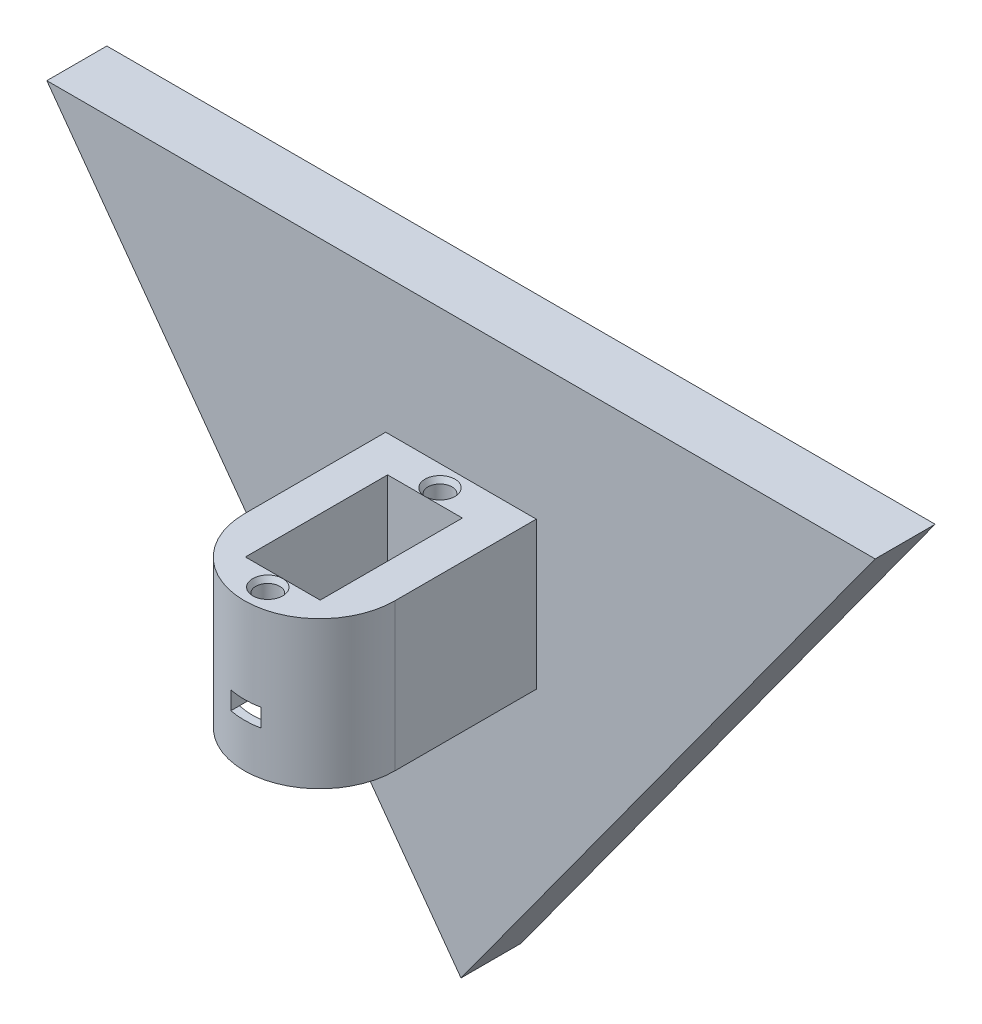
ISO-10303-21;
HEADER;
FILE_DESCRIPTION(('STEP AP214'),'2;1');
FILE_NAME('part.step','',(''),(''),'','','');
FILE_SCHEMA(('AUTOMOTIVE_DESIGN { 1 0 10303 214 1 1 1 1 }'));
ENDSEC;
DATA;
#1=APPLICATION_CONTEXT('core data for automotive mechanical design processes');
#2=APPLICATION_PROTOCOL_DEFINITION('international standard','automotive_design',2000,#1);
#3=PRODUCT_CONTEXT('',#1,'mechanical');
#4=PRODUCT('Part','Part','',(#3));
#5=PRODUCT_RELATED_PRODUCT_CATEGORY('part','',(#4));
#6=PRODUCT_DEFINITION_FORMATION('','',#4);
#7=PRODUCT_DEFINITION_CONTEXT('part definition',#1,'design');
#8=PRODUCT_DEFINITION('design','',#6,#7);
#9=PRODUCT_DEFINITION_SHAPE('','',#8);
#10=(LENGTH_UNIT() NAMED_UNIT(*) SI_UNIT(.MILLI.,.METRE.));
#11=(NAMED_UNIT(*) PLANE_ANGLE_UNIT() SI_UNIT($,.RADIAN.));
#12=(NAMED_UNIT(*) SI_UNIT($,.STERADIAN.) SOLID_ANGLE_UNIT());
#13=UNCERTAINTY_MEASURE_WITH_UNIT(LENGTH_MEASURE(1.E-05),#10,'distance_accuracy_value','');
#14=(GEOMETRIC_REPRESENTATION_CONTEXT(3) GLOBAL_UNCERTAINTY_ASSIGNED_CONTEXT((#13)) GLOBAL_UNIT_ASSIGNED_CONTEXT((#10,
#11,#12)) REPRESENTATION_CONTEXT('',''));
#15=CARTESIAN_POINT('',(0.,0.,0.));
#16=DIRECTION('',(0.,0.,1.));
#17=DIRECTION('',(1.,0.,0.));
#18=AXIS2_PLACEMENT_3D('',#15,#16,#17);
#19=CARTESIAN_POINT('',(-6.23,55.2500254806121,16.));
#20=DIRECTION('',(0.,1.,0.));
#21=DIRECTION('',(0.,0.,1.));
#22=AXIS2_PLACEMENT_3D('',#19,#20,#21);
#23=PLANE('',#22);
#24=DIRECTION('',(0.,0.,1.));
#25=VECTOR('',#24,1.);
#26=CARTESIAN_POINT('',(2.50000000000001,55.2500254806121,-0.001000000000001));
#27=LINE('',#26,#25);
#28=CARTESIAN_POINT('',(2.50000000000001,55.2500254806121,39.7));
#29=VERTEX_POINT('',#28);
#30=CARTESIAN_POINT('',(2.50000000000001,55.2500254806121,44.4161170617659));
#31=VERTEX_POINT('',#30);
#32=EDGE_CURVE('E191',#29,#31,#27,.T.);
#33=ORIENTED_EDGE('',*,*,#32,.F.);
#34=DIRECTION('',(1.,0.,0.));
#35=VECTOR('',#34,1.);
#36=CARTESIAN_POINT('',(-6.23,55.2500254806121,39.7));
#37=LINE('',#36,#35);
#38=CARTESIAN_POINT('',(6.23,55.2500254806121,39.7));
#39=VERTEX_POINT('',#38);
#40=EDGE_CURVE('E264',#29,#39,#37,.T.);
#41=ORIENTED_EDGE('',*,*,#40,.T.);
#42=DIRECTION('',(0.,0.,-1.));
#43=VECTOR('',#42,1.);
#44=CARTESIAN_POINT('',(6.23,55.2500254806121,39.7));
#45=LINE('',#44,#43);
#46=CARTESIAN_POINT('',(6.23,55.2500254806121,24.3028599015696));
#47=VERTEX_POINT('',#46);
#48=EDGE_CURVE('E257',#39,#47,#45,.T.);
#49=ORIENTED_EDGE('',*,*,#48,.T.);
#50=CARTESIAN_POINT('',(0.,55.2500254806121,33.55));
#51=DIRECTION('',(0.,1.,0.));
#52=DIRECTION('',(0.,0.,1.));
#53=AXIS2_PLACEMENT_3D('',#50,#51,#52);
#54=CIRCLE('',#53,11.15);
#55=EDGE_CURVE('E252',#31,#47,#54,.T.);
#56=ORIENTED_EDGE('',*,*,#55,.F.);
#57=EDGE_LOOP('',(#33,#41,#49,#56));
#58=FACE_BOUND('',#57,.T.);
#59=ADVANCED_FACE('F41',(#58),#23,.F.);
#60=CARTESIAN_POINT('',(-6.23,11.2879454134343,39.7));
#61=DIRECTION('',(0.,0.,-1.));
#62=DIRECTION('',(-1.,0.,0.));
#63=AXIS2_PLACEMENT_3D('',#60,#61,#62);
#64=PLANE('',#63);
#65=DIRECTION('',(-1.,0.,0.));
#66=VECTOR('',#65,1.);
#67=CARTESIAN_POINT('',(-2.49999999999999,58.2500254806121,39.7));
#68=LINE('',#67,#66);
#69=CARTESIAN_POINT('',(2.50000000000001,58.2500254806121,39.7));
#70=VERTEX_POINT('',#69);
#71=CARTESIAN_POINT('',(-2.49999999999999,58.2500254806121,39.7));
#72=VERTEX_POINT('',#71);
#73=EDGE_CURVE('E205',#70,#72,#68,.T.);
#74=ORIENTED_EDGE('',*,*,#73,.T.);
#75=DIRECTION('',(0.,-1.,0.));
#76=VECTOR('',#75,1.);
#77=CARTESIAN_POINT('',(-2.49999999999999,58.2500254806121,39.7));
#78=LINE('',#77,#76);
#79=CARTESIAN_POINT('',(-2.49999999999999,55.2500254806121,39.7));
#80=VERTEX_POINT('',#79);
#81=EDGE_CURVE('E200',#72,#80,#78,.T.);
#82=ORIENTED_EDGE('',*,*,#81,.T.);
#83=CARTESIAN_POINT('',(-6.23,55.2500254806121,39.7));
#84=VERTEX_POINT('',#83);
#85=EDGE_CURVE('E288',#84,#80,#37,.T.);
#86=ORIENTED_EDGE('',*,*,#85,.F.);
#87=DIRECTION('',(0.,1.,0.));
#88=VECTOR('',#87,1.);
#89=CARTESIAN_POINT('',(-6.23,11.2879454134343,39.7));
#90=LINE('',#89,#88);
#91=CARTESIAN_POINT('',(-6.23,72.5000254806121,39.7));
#92=VERTEX_POINT('',#91);
#93=EDGE_CURVE('E284',#84,#92,#90,.T.);
#94=ORIENTED_EDGE('',*,*,#93,.T.);
#95=DIRECTION('',(-1.,0.,0.));
#96=VECTOR('',#95,1.);
#97=CARTESIAN_POINT('',(-6.23,72.5000254806121,39.7));
#98=LINE('',#97,#96);
#99=CARTESIAN_POINT('',(0.,72.5000254806121,39.7));
#100=VERTEX_POINT('',#99);
#101=EDGE_CURVE('E263',#100,#92,#98,.T.);
#102=ORIENTED_EDGE('',*,*,#101,.F.);
#103=CARTESIAN_POINT('',(6.23,72.5000254806121,39.7));
#104=VERTEX_POINT('',#103);
#105=EDGE_CURVE('E266',#104,#100,#98,.T.);
#106=ORIENTED_EDGE('',*,*,#105,.F.);
#107=DIRECTION('',(0.,1.,0.));
#108=VECTOR('',#107,1.);
#109=CARTESIAN_POINT('',(6.23,11.2879454134343,39.7));
#110=LINE('',#109,#108);
#111=EDGE_CURVE('E276',#39,#104,#110,.T.);
#112=ORIENTED_EDGE('',*,*,#111,.F.);
#113=ORIENTED_EDGE('',*,*,#40,.F.);
#114=DIRECTION('',(0.,1.,0.));
#115=VECTOR('',#114,1.);
#116=CARTESIAN_POINT('',(2.50000000000001,58.2500254806121,39.7));
#117=LINE('',#116,#115);
#118=EDGE_CURVE('E210',#29,#70,#117,.T.);
#119=ORIENTED_EDGE('',*,*,#118,.T.);
#120=EDGE_LOOP('',(#74,#82,#86,#94,#102,#106,#112,#113,#119));
#121=FACE_BOUND('',#120,.T.);
#122=ADVANCED_FACE('F347',(#121),#64,.T.);
#123=CARTESIAN_POINT('',(-6.23,72.5000254806121,16.));
#124=DIRECTION('',(0.,-1.,0.));
#125=DIRECTION('',(0.,0.,-1.));
#126=AXIS2_PLACEMENT_3D('',#123,#124,#125);
#127=PLANE('',#126);
#128=DIRECTION('',(0.,0.,1.));
#129=VECTOR('',#128,1.);
#130=CARTESIAN_POINT('',(-12.5467811820916,72.5000254806121,33.55));
#131=LINE('',#130,#129);
#132=CARTESIAN_POINT('',(-12.5467811820916,72.5000254806121,10.));
#133=VERTEX_POINT('',#132);
#134=CARTESIAN_POINT('',(-12.5467811820916,72.5000254806121,33.55));
#135=VERTEX_POINT('',#134);
#136=EDGE_CURVE('E272',#133,#135,#131,.T.);
#137=ORIENTED_EDGE('',*,*,#136,.T.);
#138=CARTESIAN_POINT('',(0.,72.5000254806121,33.55));
#139=DIRECTION('',(0.,1.,0.));
#140=DIRECTION('',(0.,0.,1.));
#141=AXIS2_PLACEMENT_3D('',#138,#139,#140);
#142=CIRCLE('',#141,12.5467811820916);
#143=CARTESIAN_POINT('',(12.5467811820916,72.5000254806121,33.55));
#144=VERTEX_POINT('',#143);
#145=EDGE_CURVE('E274',#135,#144,#142,.T.);
#146=ORIENTED_EDGE('',*,*,#145,.T.);
#147=DIRECTION('',(0.,0.,-1.));
#148=VECTOR('',#147,1.);
#149=CARTESIAN_POINT('',(12.5467811820916,72.5000254806121,33.55));
#150=LINE('',#149,#148);
#151=CARTESIAN_POINT('',(12.5467811820916,72.5000254806121,10.));
#152=VERTEX_POINT('',#151);
#153=EDGE_CURVE('E280',#144,#152,#150,.T.);
#154=ORIENTED_EDGE('',*,*,#153,.T.);
#155=DIRECTION('',(-1.,0.,0.));
#156=VECTOR('',#155,1.);
#157=CARTESIAN_POINT('',(-6.23,72.5000254806121,10.));
#158=LINE('',#157,#156);
#159=EDGE_CURVE('E174',#152,#133,#158,.T.);
#160=ORIENTED_EDGE('',*,*,#159,.T.);
#161=EDGE_LOOP('',(#137,#146,#154,#160));
#162=FACE_BOUND('',#161,.T.);
#163=DIRECTION('',(0.,0.,-1.));
#164=VECTOR('',#163,1.);
#165=CARTESIAN_POINT('',(-6.23,72.5000254806121,10.));
#166=LINE('',#165,#164);
#167=CARTESIAN_POINT('',(-6.23,72.5000254806121,16.));
#168=VERTEX_POINT('',#167);
#169=EDGE_CURVE('E267',#92,#168,#166,.T.);
#170=ORIENTED_EDGE('',*,*,#169,.T.);
#171=DIRECTION('',(-1.,0.,0.));
#172=VECTOR('',#171,1.);
#173=CARTESIAN_POINT('',(-6.23,72.5000254806121,16.));
#174=LINE('',#173,#172);
#175=CARTESIAN_POINT('',(0.,72.5000254806121,16.));
#176=VERTEX_POINT('',#175);
#177=EDGE_CURVE('E299',#176,#168,#174,.T.);
#178=ORIENTED_EDGE('',*,*,#177,.F.);
#179=CARTESIAN_POINT('',(0.,72.5000254806121,13.5));
#180=DIRECTION('',(0.,-1.,0.));
#181=DIRECTION('',(0.,0.,-1.));
#182=AXIS2_PLACEMENT_3D('',#179,#180,#181);
#183=CIRCLE('',#182,2.50000000000001);
#184=EDGE_CURVE('E318',#176,#176,#183,.T.);
#185=ORIENTED_EDGE('',*,*,#184,.T.);
#186=CARTESIAN_POINT('',(6.23,72.5000254806121,16.));
#187=VERTEX_POINT('',#186);
#188=EDGE_CURVE('E297',#187,#176,#174,.T.);
#189=ORIENTED_EDGE('',*,*,#188,.F.);
#190=DIRECTION('',(0.,0.,1.));
#191=VECTOR('',#190,1.);
#192=CARTESIAN_POINT('',(6.23,72.5000254806121,39.7));
#193=LINE('',#192,#191);
#194=EDGE_CURVE('E253',#187,#104,#193,.T.);
#195=ORIENTED_EDGE('',*,*,#194,.T.);
#196=ORIENTED_EDGE('',*,*,#105,.T.);
#197=CARTESIAN_POINT('',(0.,72.5000254806121,42.2));
#198=DIRECTION('',(0.,-1.,0.));
#199=DIRECTION('',(0.,0.,-1.));
#200=AXIS2_PLACEMENT_3D('',#197,#198,#199);
#201=CIRCLE('',#200,2.50000000000002);
#202=EDGE_CURVE('E321',#100,#100,#201,.T.);
#203=ORIENTED_EDGE('',*,*,#202,.T.);
#204=ORIENTED_EDGE('',*,*,#101,.T.);
#205=EDGE_LOOP('',(#170,#178,#185,#189,#195,#196,#203,#204));
#206=FACE_BOUND('',#205,.T.);
#207=ADVANCED_FACE('F352',(#162,#206),#127,.F.);
#208=CARTESIAN_POINT('',(0.,11.2879454134343,33.55));
#209=DIRECTION('',(0.,1.,0.));
#210=DIRECTION('',(0.,0.,1.));
#211=AXIS2_PLACEMENT_3D('',#208,#209,#210);
#212=CYLINDRICAL_SURFACE('',#211,12.5467811820916);
#213=CARTESIAN_POINT('',(0.,47.9500254806121,33.55));
#214=DIRECTION('',(0.,-1.,0.));
#215=DIRECTION('',(0.,0.,-1.));
#216=AXIS2_PLACEMENT_3D('',#213,#214,#215);
#217=CIRCLE('',#216,12.5467811820916);
#218=CARTESIAN_POINT('',(12.5467811820916,47.9500254806121,33.55));
#219=VERTEX_POINT('',#218);
#220=CARTESIAN_POINT('',(-12.5467811820916,47.9500254806121,33.55));
#221=VERTEX_POINT('',#220);
#222=EDGE_CURVE('E248',#219,#221,#217,.T.);
#223=ORIENTED_EDGE('',*,*,#222,.F.);
#224=DIRECTION('',(0.,1.,0.));
#225=VECTOR('',#224,1.);
#226=CARTESIAN_POINT('',(12.5467811820916,11.2879454134343,33.55));
#227=LINE('',#226,#225);
#228=EDGE_CURVE('E181',#219,#144,#227,.T.);
#229=ORIENTED_EDGE('',*,*,#228,.T.);
#230=ORIENTED_EDGE('',*,*,#145,.F.);
#231=DIRECTION('',(0.,1.,0.));
#232=VECTOR('',#231,1.);
#233=CARTESIAN_POINT('',(-12.5467811820916,11.2879454134343,33.55));
#234=LINE('',#233,#232);
#235=EDGE_CURVE('E62',#221,#135,#234,.T.);
#236=ORIENTED_EDGE('',*,*,#235,.F.);
#237=EDGE_LOOP('',(#223,#229,#230,#236));
#238=FACE_BOUND('',#237,.T.);
#239=CARTESIAN_POINT('',(0.,55.2500254806121,33.55));
#240=DIRECTION('',(0.,-1.,0.));
#241=DIRECTION('',(0.,0.,-1.));
#242=AXIS2_PLACEMENT_3D('',#239,#240,#241);
#243=CIRCLE('',#242,12.5467811820916);
#244=CARTESIAN_POINT('',(2.50000000000001,55.2500254806121,45.8451908497302));
#245=VERTEX_POINT('',#244);
#246=CARTESIAN_POINT('',(-2.49999999999999,55.2500254806121,45.8451908497302));
#247=VERTEX_POINT('',#246);
#248=EDGE_CURVE('E216',#245,#247,#243,.T.);
#249=ORIENTED_EDGE('',*,*,#248,.T.);
#250=DIRECTION('',(0.,1.,0.));
#251=VECTOR('',#250,1.);
#252=CARTESIAN_POINT('',(-2.49999999999999,11.2879454134343,45.8451908497302));
#253=LINE('',#252,#251);
#254=CARTESIAN_POINT('',(-2.49999999999999,58.2500254806121,45.8451908497302));
#255=VERTEX_POINT('',#254);
#256=EDGE_CURVE('E201',#247,#255,#253,.T.);
#257=ORIENTED_EDGE('',*,*,#256,.T.);
#258=CARTESIAN_POINT('',(0.,58.2500254806121,33.55));
#259=DIRECTION('',(0.,1.,0.));
#260=DIRECTION('',(0.,0.,1.));
#261=AXIS2_PLACEMENT_3D('',#258,#259,#260);
#262=CIRCLE('',#261,12.5467811820916);
#263=CARTESIAN_POINT('',(2.50000000000001,58.2500254806121,45.8451908497302));
#264=VERTEX_POINT('',#263);
#265=EDGE_CURVE('E207',#255,#264,#262,.T.);
#266=ORIENTED_EDGE('',*,*,#265,.T.);
#267=DIRECTION('',(0.,1.,0.));
#268=VECTOR('',#267,1.);
#269=CARTESIAN_POINT('',(2.50000000000001,11.2879454134343,45.8451908497302));
#270=LINE('',#269,#268);
#271=EDGE_CURVE('E208',#264,#245,#270,.F.);
#272=ORIENTED_EDGE('',*,*,#271,.T.);
#273=EDGE_LOOP('',(#249,#257,#266,#272));
#274=FACE_BOUND('',#273,.T.);
#275=ADVANCED_FACE('F371',(#238,#274),#212,.T.);
#276=CARTESIAN_POINT('',(0.,107.987681704295,33.55));
#277=DIRECTION('',(0.,-1.,0.));
#278=DIRECTION('',(0.,0.,-1.));
#279=AXIS2_PLACEMENT_3D('',#276,#277,#278);
#280=CYLINDRICAL_SURFACE('',#279,11.15);
#281=CARTESIAN_POINT('',(0.,47.9500254806121,33.55));
#282=DIRECTION('',(0.,-1.,0.));
#283=DIRECTION('',(0.,0.,-1.));
#284=AXIS2_PLACEMENT_3D('',#281,#282,#283);
#285=CIRCLE('',#284,11.15);
#286=CARTESIAN_POINT('',(0.,47.9500254806121,22.4));
#287=VERTEX_POINT('',#286);
#288=EDGE_CURVE('E242',#287,#287,#285,.T.);
#289=ORIENTED_EDGE('',*,*,#288,.T.);
#290=EDGE_LOOP('',(#289));
#291=FACE_BOUND('',#290,.T.);
#292=CARTESIAN_POINT('',(0.,55.2500254806121,33.55));
#293=DIRECTION('',(0.,1.,0.));
#294=DIRECTION('',(0.,0.,1.));
#295=AXIS2_PLACEMENT_3D('',#292,#293,#294);
#296=CIRCLE('',#295,11.15);
#297=CARTESIAN_POINT('',(-6.23,55.2500254806121,24.3028599015696));
#298=VERTEX_POINT('',#297);
#299=EDGE_CURVE('E11',#298,#47,#296,.F.);
#300=ORIENTED_EDGE('',*,*,#299,.F.);
#301=CARTESIAN_POINT('',(-2.49999999999999,55.2500254806121,44.4161170617659));
#302=VERTEX_POINT('',#301);
#303=EDGE_CURVE('E255',#298,#302,#54,.T.);
#304=ORIENTED_EDGE('',*,*,#303,.T.);
#305=EDGE_CURVE('E258',#302,#31,#54,.T.);
#306=ORIENTED_EDGE('',*,*,#305,.T.);
#307=ORIENTED_EDGE('',*,*,#55,.T.);
#308=EDGE_LOOP('',(#300,#304,#306,#307));
#309=FACE_BOUND('',#308,.T.);
#310=ADVANCED_FACE('F365',(#291,#309),#280,.F.);
#311=ORIENTED_EDGE('',*,*,#85,.T.);
#312=DIRECTION('',(0.,0.,1.));
#313=VECTOR('',#312,1.);
#314=CARTESIAN_POINT('',(-2.49999999999999,55.2500254806121,-0.001000000000001));
#315=LINE('',#314,#313);
#316=EDGE_CURVE('E217',#80,#302,#315,.T.);
#317=ORIENTED_EDGE('',*,*,#316,.T.);
#318=ORIENTED_EDGE('',*,*,#303,.F.);
#319=DIRECTION('',(0.,0.,1.));
#320=VECTOR('',#319,1.);
#321=CARTESIAN_POINT('',(-6.23,55.2500254806121,10.));
#322=LINE('',#321,#320);
#323=EDGE_CURVE('E179',#298,#84,#322,.T.);
#324=ORIENTED_EDGE('',*,*,#323,.T.);
#325=EDGE_LOOP('',(#311,#317,#318,#324));
#326=FACE_BOUND('',#325,.T.);
#327=ADVANCED_FACE('F346',(#326),#23,.F.);
#328=CARTESIAN_POINT('',(-54.4906896004018,75.,10.));
#329=DIRECTION('',(0.809016994374949,0.587785252292471,0.));
#330=DIRECTION('',(-0.587785252292471,0.809016994374949,0.));
#331=AXIS2_PLACEMENT_3D('',#328,#329,#330);
#332=PLANE('',#331);
#333=DIRECTION('',(0.587785252292471,-0.809016994374949,0.));
#334=VECTOR('',#333,1.);
#335=CARTESIAN_POINT('',(-54.4906896004018,75.,0.));
#336=LINE('',#335,#334);
#337=CARTESIAN_POINT('',(-69.0215401605087,95.,0.));
#338=VERTEX_POINT('',#337);
#339=CARTESIAN_POINT('',(0.,0.,0.));
#340=VERTEX_POINT('',#339);
#341=EDGE_CURVE('E303',#338,#340,#336,.T.);
#342=ORIENTED_EDGE('',*,*,#341,.T.);
#343=DIRECTION('',(0.,0.,-1.));
#344=VECTOR('',#343,1.);
#345=CARTESIAN_POINT('',(0.,0.,10.));
#346=LINE('',#345,#344);
#347=CARTESIAN_POINT('',(0.,0.,10.));
#348=VERTEX_POINT('',#347);
#349=EDGE_CURVE('E311',#348,#340,#346,.T.);
#350=ORIENTED_EDGE('',*,*,#349,.F.);
#351=DIRECTION('',(0.587785252292471,-0.809016994374949,0.));
#352=VECTOR('',#351,1.);
#353=CARTESIAN_POINT('',(-54.4906896004018,75.,10.));
#354=LINE('',#353,#352);
#355=CARTESIAN_POINT('',(-69.0215401605087,95.,10.));
#356=VERTEX_POINT('',#355);
#357=EDGE_CURVE('E304',#356,#348,#354,.T.);
#358=ORIENTED_EDGE('',*,*,#357,.F.);
#359=DIRECTION('',(0.,0.,-1.));
#360=VECTOR('',#359,1.);
#361=CARTESIAN_POINT('',(-69.0215401605087,95.,10.));
#362=LINE('',#361,#360);
#363=EDGE_CURVE('E235',#356,#338,#362,.T.);
#364=ORIENTED_EDGE('',*,*,#363,.T.);
#365=EDGE_LOOP('',(#342,#350,#358,#364));
#366=FACE_BOUND('',#365,.T.);
#367=ADVANCED_FACE('F363',(#366),#332,.F.);
#368=CARTESIAN_POINT('',(0.,0.,10.));
#369=DIRECTION('',(-0.809016994374949,0.587785252292471,0.));
#370=DIRECTION('',(-0.587785252292471,-0.809016994374949,0.));
#371=AXIS2_PLACEMENT_3D('',#368,#369,#370);
#372=PLANE('',#371);
#373=DIRECTION('',(0.587785252292471,0.809016994374949,0.));
#374=VECTOR('',#373,1.);
#375=CARTESIAN_POINT('',(0.,0.,0.));
#376=LINE('',#375,#374);
#377=CARTESIAN_POINT('',(69.0215401605087,95.,0.));
#378=VERTEX_POINT('',#377);
#379=EDGE_CURVE('E307',#340,#378,#376,.T.);
#380=ORIENTED_EDGE('',*,*,#379,.T.);
#381=DIRECTION('',(0.,0.,-1.));
#382=VECTOR('',#381,1.);
#383=CARTESIAN_POINT('',(69.0215401605087,95.,10.));
#384=LINE('',#383,#382);
#385=CARTESIAN_POINT('',(69.0215401605087,95.,10.));
#386=VERTEX_POINT('',#385);
#387=EDGE_CURVE('E240',#386,#378,#384,.T.);
#388=ORIENTED_EDGE('',*,*,#387,.F.);
#389=DIRECTION('',(0.587785252292471,0.809016994374949,0.));
#390=VECTOR('',#389,1.);
#391=CARTESIAN_POINT('',(0.,0.,10.));
#392=LINE('',#391,#390);
#393=EDGE_CURVE('E308',#348,#386,#392,.T.);
#394=ORIENTED_EDGE('',*,*,#393,.F.);
#395=ORIENTED_EDGE('',*,*,#349,.T.);
#396=EDGE_LOOP('',(#380,#388,#394,#395));
#397=FACE_BOUND('',#396,.T.);
#398=ADVANCED_FACE('F368',(#397),#372,.F.);
#399=CARTESIAN_POINT('',(0.,0.,10.));
#400=DIRECTION('',(0.,0.,1.));
#401=DIRECTION('',(1.,0.,0.));
#402=AXIS2_PLACEMENT_3D('',#399,#400,#401);
#403=PLANE('',#402);
#404=DIRECTION('',(1.,0.,0.));
#405=VECTOR('',#404,1.);
#406=CARTESIAN_POINT('',(-12.5467811820916,47.9500254806121,10.));
#407=LINE('',#406,#405);
#408=CARTESIAN_POINT('',(-12.5467811820916,47.9500254806121,10.));
#409=VERTEX_POINT('',#408);
#410=CARTESIAN_POINT('',(12.5467811820916,47.9500254806121,10.));
#411=VERTEX_POINT('',#410);
#412=EDGE_CURVE('E173',#409,#411,#407,.T.);
#413=ORIENTED_EDGE('',*,*,#412,.F.);
#414=DIRECTION('',(0.,1.,0.));
#415=VECTOR('',#414,1.);
#416=CARTESIAN_POINT('',(-12.5467811820916,11.2879454134343,10.));
#417=LINE('',#416,#415);
#418=EDGE_CURVE('E60',#409,#133,#417,.T.);
#419=ORIENTED_EDGE('',*,*,#418,.T.);
#420=ORIENTED_EDGE('',*,*,#159,.F.);
#421=DIRECTION('',(0.,1.,0.));
#422=VECTOR('',#421,1.);
#423=CARTESIAN_POINT('',(12.5467811820916,11.2879454134343,10.));
#424=LINE('',#423,#422);
#425=EDGE_CURVE('E169',#411,#152,#424,.T.);
#426=ORIENTED_EDGE('',*,*,#425,.F.);
#427=EDGE_LOOP('',(#413,#419,#420,#426));
#428=FACE_BOUND('',#427,.T.);
#429=ORIENTED_EDGE('',*,*,#357,.T.);
#430=ORIENTED_EDGE('',*,*,#393,.T.);
#431=DIRECTION('',(-1.,0.,0.));
#432=VECTOR('',#431,1.);
#433=CARTESIAN_POINT('',(-69.0215401605087,95.,10.));
#434=LINE('',#433,#432);
#435=EDGE_CURVE('E230',#386,#356,#434,.T.);
#436=ORIENTED_EDGE('',*,*,#435,.T.);
#437=EDGE_LOOP('',(#429,#430,#436));
#438=FACE_BOUND('',#437,.T.);
#439=ADVANCED_FACE('F171',(#428,#438),#403,.T.);
#440=CARTESIAN_POINT('',(0.,0.,0.));
#441=DIRECTION('',(0.,0.,1.));
#442=DIRECTION('',(1.,0.,0.));
#443=AXIS2_PLACEMENT_3D('',#440,#441,#442);
#444=PLANE('',#443);
#445=ORIENTED_EDGE('',*,*,#341,.F.);
#446=DIRECTION('',(-1.,0.,0.));
#447=VECTOR('',#446,1.);
#448=CARTESIAN_POINT('',(-69.0215401605087,95.,0.));
#449=LINE('',#448,#447);
#450=EDGE_CURVE('E198',#378,#338,#449,.T.);
#451=ORIENTED_EDGE('',*,*,#450,.F.);
#452=ORIENTED_EDGE('',*,*,#379,.F.);
#453=EDGE_LOOP('',(#445,#451,#452));
#454=FACE_BOUND('',#453,.T.);
#455=ADVANCED_FACE('F419',(#454),#444,.F.);
#456=CARTESIAN_POINT('',(0.,0.,16.));
#457=DIRECTION('',(0.,0.,-1.));
#458=DIRECTION('',(-1.,0.,0.));
#459=AXIS2_PLACEMENT_3D('',#456,#457,#458);
#460=PLANE('',#459);
#461=DIRECTION('',(0.,-1.,0.));
#462=VECTOR('',#461,1.);
#463=CARTESIAN_POINT('',(-6.23,55.2500254806121,16.));
#464=LINE('',#463,#462);
#465=CARTESIAN_POINT('',(-6.23,55.2500254806121,16.));
#466=VERTEX_POINT('',#465);
#467=EDGE_CURVE('E293',#168,#466,#464,.T.);
#468=ORIENTED_EDGE('',*,*,#467,.T.);
#469=DIRECTION('',(1.,0.,0.));
#470=VECTOR('',#469,1.);
#471=CARTESIAN_POINT('',(-6.23,55.2500254806121,16.));
#472=LINE('',#471,#470);
#473=CARTESIAN_POINT('',(6.23,55.2500254806121,16.));
#474=VERTEX_POINT('',#473);
#475=EDGE_CURVE('E295',#466,#474,#472,.T.);
#476=ORIENTED_EDGE('',*,*,#475,.T.);
#477=DIRECTION('',(0.,1.,0.));
#478=VECTOR('',#477,1.);
#479=CARTESIAN_POINT('',(6.23,55.2500254806121,16.));
#480=LINE('',#479,#478);
#481=EDGE_CURVE('E300',#474,#187,#480,.T.);
#482=ORIENTED_EDGE('',*,*,#481,.T.);
#483=ORIENTED_EDGE('',*,*,#188,.T.);
#484=ORIENTED_EDGE('',*,*,#177,.T.);
#485=EDGE_LOOP('',(#468,#476,#482,#483,#484));
#486=FACE_BOUND('',#485,.T.);
#487=ADVANCED_FACE('F410',(#486),#460,.F.);
#488=CARTESIAN_POINT('',(-6.23,11.2879454134343,10.));
#489=DIRECTION('',(1.,0.,0.));
#490=DIRECTION('',(0.,0.,-1.));
#491=AXIS2_PLACEMENT_3D('',#488,#489,#490);
#492=PLANE('',#491);
#493=ORIENTED_EDGE('',*,*,#467,.F.);
#494=ORIENTED_EDGE('',*,*,#169,.F.);
#495=ORIENTED_EDGE('',*,*,#93,.F.);
#496=ORIENTED_EDGE('',*,*,#323,.F.);
#497=EDGE_CURVE('E260',#466,#298,#322,.T.);
#498=ORIENTED_EDGE('',*,*,#497,.F.);
#499=EDGE_LOOP('',(#493,#494,#495,#496,#498));
#500=FACE_BOUND('',#499,.T.);
#501=ADVANCED_FACE('F415',(#500),#492,.T.);
#502=CARTESIAN_POINT('',(6.23,11.2879454134343,39.7));
#503=DIRECTION('',(-1.,0.,0.));
#504=DIRECTION('',(0.,0.,1.));
#505=AXIS2_PLACEMENT_3D('',#502,#503,#504);
#506=PLANE('',#505);
#507=EDGE_CURVE('E259',#47,#474,#45,.T.);
#508=ORIENTED_EDGE('',*,*,#507,.F.);
#509=ORIENTED_EDGE('',*,*,#48,.F.);
#510=ORIENTED_EDGE('',*,*,#111,.T.);
#511=ORIENTED_EDGE('',*,*,#194,.F.);
#512=ORIENTED_EDGE('',*,*,#481,.F.);
#513=EDGE_LOOP('',(#508,#509,#510,#511,#512));
#514=FACE_BOUND('',#513,.T.);
#515=ADVANCED_FACE('F399',(#514),#506,.T.);
#516=CARTESIAN_POINT('',(12.5467811820916,11.2879454134343,33.55));
#517=DIRECTION('',(1.,0.,0.));
#518=DIRECTION('',(0.,0.,-1.));
#519=AXIS2_PLACEMENT_3D('',#516,#517,#518);
#520=PLANE('',#519);
#521=ORIENTED_EDGE('',*,*,#228,.F.);
#522=DIRECTION('',(0.,0.,1.));
#523=VECTOR('',#522,1.);
#524=CARTESIAN_POINT('',(12.5467811820916,47.9500254806121,10.));
#525=LINE('',#524,#523);
#526=EDGE_CURVE('E190',#411,#219,#525,.T.);
#527=ORIENTED_EDGE('',*,*,#526,.F.);
#528=ORIENTED_EDGE('',*,*,#425,.T.);
#529=ORIENTED_EDGE('',*,*,#153,.F.);
#530=EDGE_LOOP('',(#521,#527,#528,#529));
#531=FACE_BOUND('',#530,.T.);
#532=ADVANCED_FACE('F188',(#531),#520,.T.);
#533=CARTESIAN_POINT('',(-12.5467811820916,11.2879454134343,33.55));
#534=DIRECTION('',(-1.,0.,0.));
#535=DIRECTION('',(0.,0.,1.));
#536=AXIS2_PLACEMENT_3D('',#533,#534,#535);
#537=PLANE('',#536);
#538=ORIENTED_EDGE('',*,*,#418,.F.);
#539=DIRECTION('',(0.,0.,-1.));
#540=VECTOR('',#539,1.);
#541=CARTESIAN_POINT('',(-12.5467811820916,47.9500254806121,33.55));
#542=LINE('',#541,#540);
#543=EDGE_CURVE('E189',#221,#409,#542,.T.);
#544=ORIENTED_EDGE('',*,*,#543,.F.);
#545=ORIENTED_EDGE('',*,*,#235,.T.);
#546=ORIENTED_EDGE('',*,*,#136,.F.);
#547=EDGE_LOOP('',(#538,#544,#545,#546));
#548=FACE_BOUND('',#547,.T.);
#549=ADVANCED_FACE('F421',(#548),#537,.T.);
#550=CARTESIAN_POINT('',(0.,47.9500254806121,33.55));
#551=DIRECTION('',(0.,-1.,0.));
#552=DIRECTION('',(0.,0.,-1.));
#553=AXIS2_PLACEMENT_3D('',#550,#551,#552);
#554=PLANE('',#553);
#555=ORIENTED_EDGE('',*,*,#222,.T.);
#556=ORIENTED_EDGE('',*,*,#543,.T.);
#557=ORIENTED_EDGE('',*,*,#412,.T.);
#558=ORIENTED_EDGE('',*,*,#526,.T.);
#559=EDGE_LOOP('',(#555,#556,#557,#558));
#560=FACE_BOUND('',#559,.T.);
#561=ORIENTED_EDGE('',*,*,#288,.F.);
#562=EDGE_LOOP('',(#561));
#563=FACE_BOUND('',#562,.T.);
#564=ADVANCED_FACE('F184',(#560,#563),#554,.T.);
#565=CARTESIAN_POINT('',(0.,67.5000254806121,42.2));
#566=DIRECTION('',(0.,1.,0.));
#567=DIRECTION('',(0.,0.,1.));
#568=AXIS2_PLACEMENT_3D('',#565,#566,#567);
#569=CYLINDRICAL_SURFACE('',#568,2.);
#570=CARTESIAN_POINT('',(0.,71.6340000768277,42.2));
#571=DIRECTION('',(0.,-1.,0.));
#572=DIRECTION('',(0.,0.,-1.));
#573=AXIS2_PLACEMENT_3D('',#570,#571,#572);
#574=CIRCLE('',#573,2.);
#575=CARTESIAN_POINT('',(0.,71.6340000768277,40.2));
#576=VERTEX_POINT('',#575);
#577=EDGE_CURVE('E320',#576,#576,#574,.F.);
#578=ORIENTED_EDGE('',*,*,#577,.T.);
#579=EDGE_LOOP('',(#578));
#580=FACE_BOUND('',#579,.T.);
#581=CARTESIAN_POINT('',(0.,67.5000254806121,42.2));
#582=DIRECTION('',(0.,1.,0.));
#583=DIRECTION('',(0.,0.,1.));
#584=AXIS2_PLACEMENT_3D('',#581,#582,#583);
#585=CIRCLE('',#584,2.);
#586=CARTESIAN_POINT('',(0.,67.5000254806121,44.2));
#587=VERTEX_POINT('',#586);
#588=EDGE_CURVE('E239',#587,#587,#585,.T.);
#589=ORIENTED_EDGE('',*,*,#588,.F.);
#590=EDGE_LOOP('',(#589));
#591=FACE_BOUND('',#590,.T.);
#592=ADVANCED_FACE('F451',(#580,#591),#569,.F.);
#593=CARTESIAN_POINT('',(0.,67.5000254806121,42.2));
#594=DIRECTION('',(0.,1.,0.));
#595=DIRECTION('',(0.,0.,1.));
#596=AXIS2_PLACEMENT_3D('',#593,#594,#595);
#597=PLANE('',#596);
#598=ORIENTED_EDGE('',*,*,#588,.T.);
#599=EDGE_LOOP('',(#598));
#600=FACE_BOUND('',#599,.T.);
#601=ADVANCED_FACE('F455',(#600),#597,.T.);
#602=CARTESIAN_POINT('',(0.,67.5000254806121,13.5));
#603=DIRECTION('',(0.,1.,0.));
#604=DIRECTION('',(0.,0.,1.));
#605=AXIS2_PLACEMENT_3D('',#602,#603,#604);
#606=CYLINDRICAL_SURFACE('',#605,2.);
#607=CARTESIAN_POINT('',(0.,71.6340000768277,13.5));
#608=DIRECTION('',(0.,-1.,0.));
#609=DIRECTION('',(0.,0.,-1.));
#610=AXIS2_PLACEMENT_3D('',#607,#608,#609);
#611=CIRCLE('',#610,2.);
#612=CARTESIAN_POINT('',(0.,71.6340000768277,11.5));
#613=VERTEX_POINT('',#612);
#614=EDGE_CURVE('E49',#613,#613,#611,.F.);
#615=ORIENTED_EDGE('',*,*,#614,.T.);
#616=EDGE_LOOP('',(#615));
#617=FACE_BOUND('',#616,.T.);
#618=CARTESIAN_POINT('',(0.,67.5000254806121,13.5));
#619=DIRECTION('',(0.,1.,0.));
#620=DIRECTION('',(0.,0.,1.));
#621=AXIS2_PLACEMENT_3D('',#618,#619,#620);
#622=CIRCLE('',#621,2.);
#623=CARTESIAN_POINT('',(0.,67.5000254806121,15.5));
#624=VERTEX_POINT('',#623);
#625=EDGE_CURVE('E241',#624,#624,#622,.T.);
#626=ORIENTED_EDGE('',*,*,#625,.F.);
#627=EDGE_LOOP('',(#626));
#628=FACE_BOUND('',#627,.T.);
#629=ADVANCED_FACE('F329',(#617,#628),#606,.F.);
#630=CARTESIAN_POINT('',(0.,67.5000254806121,13.5));
#631=DIRECTION('',(0.,1.,0.));
#632=DIRECTION('',(0.,0.,1.));
#633=AXIS2_PLACEMENT_3D('',#630,#631,#632);
#634=PLANE('',#633);
#635=ORIENTED_EDGE('',*,*,#625,.T.);
#636=EDGE_LOOP('',(#635));
#637=FACE_BOUND('',#636,.T.);
#638=ADVANCED_FACE('F341',(#637),#634,.T.);
#639=CARTESIAN_POINT('',(0.,71.6340000768277,42.2));
#640=DIRECTION('',(0.,1.,0.));
#641=DIRECTION('',(0.,0.,1.));
#642=AXIS2_PLACEMENT_3D('',#639,#640,#641);
#643=CONICAL_SURFACE('',#642,2.,0.523598775598295);
#644=ORIENTED_EDGE('',*,*,#202,.F.);
#645=EDGE_LOOP('',(#644));
#646=FACE_BOUND('',#645,.T.);
#647=ORIENTED_EDGE('',*,*,#577,.F.);
#648=EDGE_LOOP('',(#647));
#649=FACE_BOUND('',#648,.T.);
#650=ADVANCED_FACE('F333',(#646,#649),#643,.F.);
#651=CARTESIAN_POINT('',(0.,71.6340000768277,13.5));
#652=DIRECTION('',(0.,1.,0.));
#653=DIRECTION('',(0.,0.,1.));
#654=AXIS2_PLACEMENT_3D('',#651,#652,#653);
#655=CONICAL_SURFACE('',#654,2.,0.523598775598297);
#656=ORIENTED_EDGE('',*,*,#184,.F.);
#657=EDGE_LOOP('',(#656));
#658=FACE_BOUND('',#657,.T.);
#659=ORIENTED_EDGE('',*,*,#614,.F.);
#660=EDGE_LOOP('',(#659));
#661=FACE_BOUND('',#660,.T.);
#662=ADVANCED_FACE('F42',(#658,#661),#655,.F.);
#663=CARTESIAN_POINT('',(-69.0215401605087,95.,10.));
#664=DIRECTION('',(0.,-1.,0.));
#665=DIRECTION('',(0.,0.,-1.));
#666=AXIS2_PLACEMENT_3D('',#663,#664,#665);
#667=PLANE('',#666);
#668=ORIENTED_EDGE('',*,*,#450,.T.);
#669=ORIENTED_EDGE('',*,*,#363,.F.);
#670=ORIENTED_EDGE('',*,*,#435,.F.);
#671=ORIENTED_EDGE('',*,*,#387,.T.);
#672=EDGE_LOOP('',(#668,#669,#670,#671));
#673=FACE_BOUND('',#672,.T.);
#674=ADVANCED_FACE('F335',(#673),#667,.F.);
#675=CARTESIAN_POINT('',(-6.23,55.2500254806121,16.));
#676=DIRECTION('',(0.,1.,0.));
#677=DIRECTION('',(0.,0.,1.));
#678=AXIS2_PLACEMENT_3D('',#675,#676,#677);
#679=PLANE('',#678);
#680=ORIENTED_EDGE('',*,*,#497,.T.);
#681=ORIENTED_EDGE('',*,*,#299,.T.);
#682=ORIENTED_EDGE('',*,*,#507,.T.);
#683=ORIENTED_EDGE('',*,*,#475,.F.);
#684=EDGE_LOOP('',(#680,#681,#682,#683));
#685=FACE_BOUND('',#684,.T.);
#686=ADVANCED_FACE('F338',(#685),#679,.T.);
#687=CARTESIAN_POINT('',(-2.49999999999999,55.2500254806121,-0.001000000000001));
#688=DIRECTION('',(0.,-1.,0.));
#689=DIRECTION('',(0.,0.,-1.));
#690=AXIS2_PLACEMENT_3D('',#687,#688,#689);
#691=PLANE('',#690);
#692=EDGE_CURVE('E223',#302,#247,#315,.T.);
#693=ORIENTED_EDGE('',*,*,#692,.T.);
#694=ORIENTED_EDGE('',*,*,#248,.F.);
#695=EDGE_CURVE('E193',#31,#245,#27,.T.);
#696=ORIENTED_EDGE('',*,*,#695,.F.);
#697=ORIENTED_EDGE('',*,*,#305,.F.);
#698=EDGE_LOOP('',(#693,#694,#696,#697));
#699=FACE_BOUND('',#698,.T.);
#700=ADVANCED_FACE('F386',(#699),#691,.F.);
#701=CARTESIAN_POINT('',(2.50000000000001,58.2500254806121,-0.001000000000001));
#702=DIRECTION('',(1.,0.,0.));
#703=DIRECTION('',(0.,0.,-1.));
#704=AXIS2_PLACEMENT_3D('',#701,#702,#703);
#705=PLANE('',#704);
#706=DIRECTION('',(0.,0.,1.));
#707=VECTOR('',#706,1.);
#708=CARTESIAN_POINT('',(2.50000000000001,58.2500254806121,-0.001000000000001));
#709=LINE('',#708,#707);
#710=EDGE_CURVE('E211',#70,#264,#709,.T.);
#711=ORIENTED_EDGE('',*,*,#710,.F.);
#712=ORIENTED_EDGE('',*,*,#118,.F.);
#713=ORIENTED_EDGE('',*,*,#32,.T.);
#714=ORIENTED_EDGE('',*,*,#695,.T.);
#715=ORIENTED_EDGE('',*,*,#271,.F.);
#716=EDGE_LOOP('',(#711,#712,#713,#714,#715));
#717=FACE_BOUND('',#716,.T.);
#718=ADVANCED_FACE('F435',(#717),#705,.F.);
#719=CARTESIAN_POINT('',(-2.49999999999999,58.2500254806121,-0.001000000000001));
#720=DIRECTION('',(0.,1.,0.));
#721=DIRECTION('',(0.,0.,1.));
#722=AXIS2_PLACEMENT_3D('',#719,#720,#721);
#723=PLANE('',#722);
#724=ORIENTED_EDGE('',*,*,#265,.F.);
#725=DIRECTION('',(0.,0.,1.));
#726=VECTOR('',#725,1.);
#727=CARTESIAN_POINT('',(-2.49999999999999,58.2500254806121,-0.001000000000001));
#728=LINE('',#727,#726);
#729=EDGE_CURVE('E204',#72,#255,#728,.T.);
#730=ORIENTED_EDGE('',*,*,#729,.F.);
#731=ORIENTED_EDGE('',*,*,#73,.F.);
#732=ORIENTED_EDGE('',*,*,#710,.T.);
#733=EDGE_LOOP('',(#724,#730,#731,#732));
#734=FACE_BOUND('',#733,.T.);
#735=ADVANCED_FACE('F432',(#734),#723,.F.);
#736=CARTESIAN_POINT('',(-2.49999999999999,58.2500254806121,-0.001000000000001));
#737=DIRECTION('',(-1.,0.,0.));
#738=DIRECTION('',(0.,0.,1.));
#739=AXIS2_PLACEMENT_3D('',#736,#737,#738);
#740=PLANE('',#739);
#741=ORIENTED_EDGE('',*,*,#316,.F.);
#742=ORIENTED_EDGE('',*,*,#81,.F.);
#743=ORIENTED_EDGE('',*,*,#729,.T.);
#744=ORIENTED_EDGE('',*,*,#256,.F.);
#745=ORIENTED_EDGE('',*,*,#692,.F.);
#746=EDGE_LOOP('',(#741,#742,#743,#744,#745));
#747=FACE_BOUND('',#746,.T.);
#748=ADVANCED_FACE('F385',(#747),#740,.F.);
#749=CLOSED_SHELL('',(#59,#122,#207,#275,#310,#327,#367,#398,#439,#455,#487,#501,#515,#532,#549,
#564,#592,#601,#629,#638,#650,#662,#674,#686,#700,#718,#735,#748));
#750=MANIFOLD_SOLID_BREP('B2',#749);
#751=ADVANCED_BREP_SHAPE_REPRESENTATION('',(#18,#750),#14);
#752=SHAPE_DEFINITION_REPRESENTATION(#9,#751);
ENDSEC;
END-ISO-10303-21;
